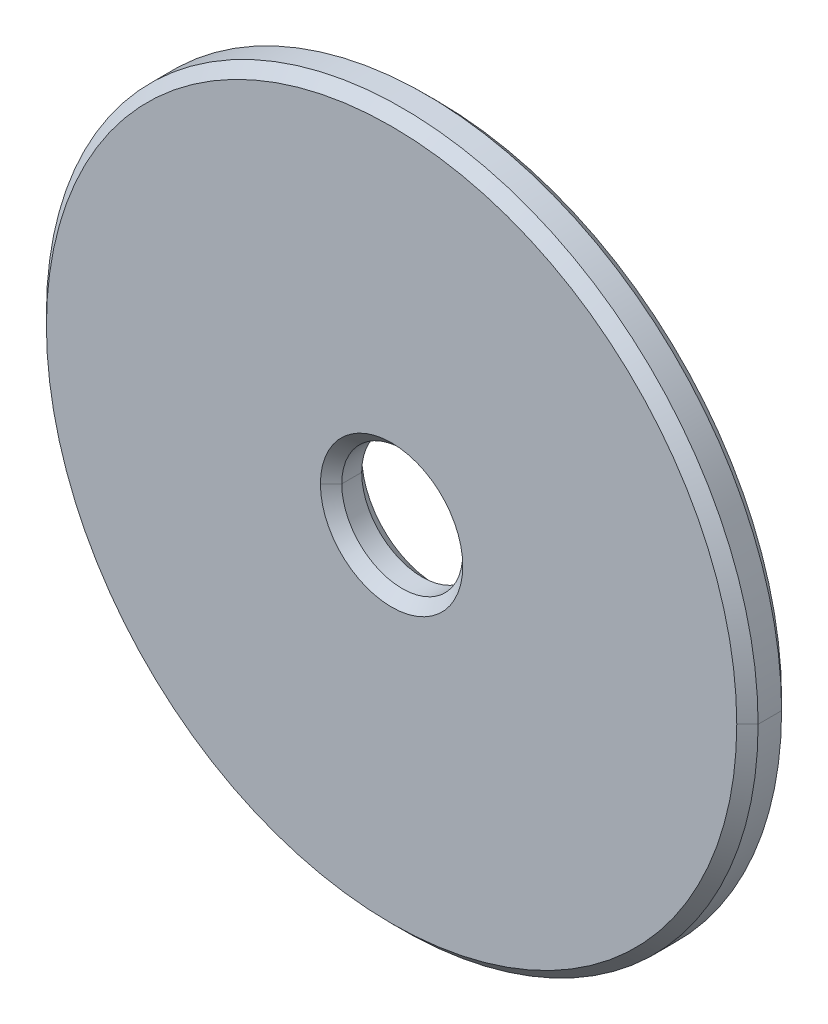
ISO-10303-21;
HEADER;
FILE_DESCRIPTION(('STEP AP214'),'2;1');
FILE_NAME('part.step','',(''),(''),'','','');
FILE_SCHEMA(('AUTOMOTIVE_DESIGN { 1 0 10303 214 1 1 1 1 }'));
ENDSEC;
DATA;
#1=APPLICATION_CONTEXT('core data for automotive mechanical design processes');
#2=APPLICATION_PROTOCOL_DEFINITION('international standard','automotive_design',2000,#1);
#3=PRODUCT_CONTEXT('',#1,'mechanical');
#4=PRODUCT('Part','Part','',(#3));
#5=PRODUCT_RELATED_PRODUCT_CATEGORY('part','',(#4));
#6=PRODUCT_DEFINITION_FORMATION('','',#4);
#7=PRODUCT_DEFINITION_CONTEXT('part definition',#1,'design');
#8=PRODUCT_DEFINITION('design','',#6,#7);
#9=PRODUCT_DEFINITION_SHAPE('','',#8);
#10=(LENGTH_UNIT() NAMED_UNIT(*) SI_UNIT(.MILLI.,.METRE.));
#11=(NAMED_UNIT(*) PLANE_ANGLE_UNIT() SI_UNIT($,.RADIAN.));
#12=(NAMED_UNIT(*) SI_UNIT($,.STERADIAN.) SOLID_ANGLE_UNIT());
#13=UNCERTAINTY_MEASURE_WITH_UNIT(LENGTH_MEASURE(1.E-05),#10,'distance_accuracy_value','');
#14=(GEOMETRIC_REPRESENTATION_CONTEXT(3) GLOBAL_UNCERTAINTY_ASSIGNED_CONTEXT((#13)) GLOBAL_UNIT_ASSIGNED_CONTEXT((#10,
#11,#12)) REPRESENTATION_CONTEXT('',''));
#15=CARTESIAN_POINT('',(0.,0.,0.));
#16=DIRECTION('',(0.,0.,1.));
#17=DIRECTION('',(1.,0.,0.));
#18=AXIS2_PLACEMENT_3D('',#15,#16,#17);
#19=CARTESIAN_POINT('',(0.,0.,3.175));
#20=DIRECTION('',(0.,0.,1.));
#21=DIRECTION('',(1.,0.,0.));
#22=AXIS2_PLACEMENT_3D('',#19,#20,#21);
#23=CYLINDRICAL_SURFACE('',#22,2.159);
#24=CARTESIAN_POINT('',(0.,0.,0.508000000000002));
#25=DIRECTION('',(0.,0.,1.));
#26=DIRECTION('',(1.,0.,0.));
#27=AXIS2_PLACEMENT_3D('',#24,#25,#26);
#28=CIRCLE('',#27,2.159);
#29=CARTESIAN_POINT('',(2.159,0.,0.508000000000001));
#30=VERTEX_POINT('',#29);
#31=CARTESIAN_POINT('',(-2.159,0.,0.508000000000001));
#32=VERTEX_POINT('',#31);
#33=EDGE_CURVE('E83',#30,#32,#28,.T.);
#34=ORIENTED_EDGE('',*,*,#33,.F.);
#35=DIRECTION('',(0.,0.,-1.));
#36=VECTOR('',#35,1.);
#37=CARTESIAN_POINT('',(2.159,0.,1.2192));
#38=LINE('',#37,#36);
#39=CARTESIAN_POINT('',(2.159,0.,1.2192));
#40=VERTEX_POINT('',#39);
#41=EDGE_CURVE('E80',#40,#30,#38,.T.);
#42=ORIENTED_EDGE('',*,*,#41,.F.);
#43=CARTESIAN_POINT('',(0.,0.,1.2192));
#44=DIRECTION('',(0.,0.,-1.));
#45=DIRECTION('',(-1.,0.,0.));
#46=AXIS2_PLACEMENT_3D('',#43,#44,#45);
#47=CIRCLE('',#46,2.159);
#48=CARTESIAN_POINT('',(-2.159,0.,1.2192));
#49=VERTEX_POINT('',#48);
#50=EDGE_CURVE('E11',#49,#40,#47,.T.);
#51=ORIENTED_EDGE('',*,*,#50,.F.);
#52=DIRECTION('',(0.,0.,-1.));
#53=VECTOR('',#52,1.);
#54=CARTESIAN_POINT('',(-2.159,0.,1.2192));
#55=LINE('',#54,#53);
#56=EDGE_CURVE('E20',#49,#32,#55,.T.);
#57=ORIENTED_EDGE('',*,*,#56,.T.);
#58=EDGE_LOOP('',(#34,#42,#51,#57));
#59=FACE_BOUND('',#58,.T.);
#60=ADVANCED_FACE('F17',(#59),#23,.F.);
#61=CARTESIAN_POINT('',(0.,0.,1.18868977120983));
#62=DIRECTION('',(0.,0.,1.));
#63=DIRECTION('',(1.,0.,0.));
#64=AXIS2_PLACEMENT_3D('',#61,#62,#63);
#65=CONICAL_SURFACE('',#64,2.12848977120982,0.785398163397453);
#66=ORIENTED_EDGE('',*,*,#50,.T.);
#67=DIRECTION('',(-0.707106781186551,0.,-0.707106781186544));
#68=VECTOR('',#67,1.);
#69=CARTESIAN_POINT('',(2.54,0.,1.6002));
#70=LINE('',#69,#68);
#71=CARTESIAN_POINT('',(2.54,0.,1.6002));
#72=VERTEX_POINT('',#71);
#73=EDGE_CURVE('E95',#72,#40,#70,.T.);
#74=ORIENTED_EDGE('',*,*,#73,.F.);
#75=CARTESIAN_POINT('',(0.,0.,1.6002));
#76=DIRECTION('',(0.,0.,-1.));
#77=DIRECTION('',(-1.,0.,0.));
#78=AXIS2_PLACEMENT_3D('',#75,#76,#77);
#79=CIRCLE('',#78,2.54);
#80=CARTESIAN_POINT('',(-2.54,0.,1.6002));
#81=VERTEX_POINT('',#80);
#82=EDGE_CURVE('E129',#81,#72,#79,.T.);
#83=ORIENTED_EDGE('',*,*,#82,.F.);
#84=DIRECTION('',(0.707106781186551,0.,-0.707106781186544));
#85=VECTOR('',#84,1.);
#86=CARTESIAN_POINT('',(-2.54,0.,1.6002));
#87=LINE('',#86,#85);
#88=EDGE_CURVE('E26',#81,#49,#87,.T.);
#89=ORIENTED_EDGE('',*,*,#88,.T.);
#90=EDGE_LOOP('',(#66,#74,#83,#89));
#91=FACE_BOUND('',#90,.T.);
#92=ADVANCED_FACE('F94',(#91),#65,.F.);
#93=CARTESIAN_POINT('',(0.,0.,1.18868977120983));
#94=DIRECTION('',(0.,0.,1.));
#95=DIRECTION('',(1.,0.,0.));
#96=AXIS2_PLACEMENT_3D('',#93,#94,#95);
#97=CONICAL_SURFACE('',#96,2.12848977120982,0.785398163397453);
#98=ORIENTED_EDGE('',*,*,#88,.F.);
#99=CARTESIAN_POINT('',(0.,0.,1.6002));
#100=DIRECTION('',(0.,0.,-1.));
#101=DIRECTION('',(1.,0.,0.));
#102=AXIS2_PLACEMENT_3D('',#99,#100,#101);
#103=CIRCLE('',#102,2.54);
#104=EDGE_CURVE('E103',#72,#81,#103,.T.);
#105=ORIENTED_EDGE('',*,*,#104,.F.);
#106=ORIENTED_EDGE('',*,*,#73,.T.);
#107=CARTESIAN_POINT('',(0.,0.,1.2192));
#108=DIRECTION('',(0.,0.,-1.));
#109=DIRECTION('',(1.,0.,0.));
#110=AXIS2_PLACEMENT_3D('',#107,#108,#109);
#111=CIRCLE('',#110,2.159);
#112=EDGE_CURVE('E89',#40,#49,#111,.T.);
#113=ORIENTED_EDGE('',*,*,#112,.T.);
#114=EDGE_LOOP('',(#98,#105,#106,#113));
#115=FACE_BOUND('',#114,.T.);
#116=ADVANCED_FACE('F100',(#115),#97,.F.);
#117=CARTESIAN_POINT('',(0.,0.,3.175));
#118=DIRECTION('',(0.,0.,-1.));
#119=DIRECTION('',(-1.,0.,0.));
#120=AXIS2_PLACEMENT_3D('',#117,#118,#119);
#121=CYLINDRICAL_SURFACE('',#120,12.7);
#122=CARTESIAN_POINT('',(0.,0.,1.21920000000001));
#123=DIRECTION('',(0.,0.,1.));
#124=DIRECTION('',(-1.,0.,0.));
#125=AXIS2_PLACEMENT_3D('',#122,#123,#124);
#126=CIRCLE('',#125,12.7);
#127=CARTESIAN_POINT('',(-12.7,0.,1.2192));
#128=VERTEX_POINT('',#127);
#129=CARTESIAN_POINT('',(12.7,0.,1.2192));
#130=VERTEX_POINT('',#129);
#131=EDGE_CURVE('E106',#128,#130,#126,.T.);
#132=ORIENTED_EDGE('',*,*,#131,.F.);
#133=DIRECTION('',(0.,0.,1.));
#134=VECTOR('',#133,1.);
#135=CARTESIAN_POINT('',(-12.7,0.,0.380999999999999));
#136=LINE('',#135,#134);
#137=CARTESIAN_POINT('',(-12.7,0.,0.381));
#138=VERTEX_POINT('',#137);
#139=EDGE_CURVE('E157',#138,#128,#136,.T.);
#140=ORIENTED_EDGE('',*,*,#139,.F.);
#141=CARTESIAN_POINT('',(0.,0.,0.380999999999996));
#142=DIRECTION('',(0.,0.,-1.));
#143=DIRECTION('',(1.,0.,0.));
#144=AXIS2_PLACEMENT_3D('',#141,#142,#143);
#145=CIRCLE('',#144,12.7);
#146=CARTESIAN_POINT('',(12.7,0.,0.381));
#147=VERTEX_POINT('',#146);
#148=EDGE_CURVE('E175',#147,#138,#145,.T.);
#149=ORIENTED_EDGE('',*,*,#148,.F.);
#150=DIRECTION('',(0.,0.,1.));
#151=VECTOR('',#150,1.);
#152=CARTESIAN_POINT('',(12.7,0.,0.380999999999999));
#153=LINE('',#152,#151);
#154=EDGE_CURVE('E116',#147,#130,#153,.T.);
#155=ORIENTED_EDGE('',*,*,#154,.T.);
#156=EDGE_LOOP('',(#132,#140,#149,#155));
#157=FACE_BOUND('',#156,.T.);
#158=ADVANCED_FACE('F239',(#157),#121,.T.);
#159=CARTESIAN_POINT('',(0.,0.,1.63071022879016));
#160=DIRECTION('',(0.,0.,-1.));
#161=DIRECTION('',(-1.,0.,0.));
#162=AXIS2_PLACEMENT_3D('',#159,#160,#161);
#163=CONICAL_SURFACE('',#162,12.2884897712098,0.785398163397443);
#164=CARTESIAN_POINT('',(0.,0.,1.60019999999998));
#165=DIRECTION('',(0.,0.,1.));
#166=DIRECTION('',(-1.,0.,0.));
#167=AXIS2_PLACEMENT_3D('',#164,#165,#166);
#168=CIRCLE('',#167,12.319);
#169=CARTESIAN_POINT('',(-12.319,0.,1.60019999999999));
#170=VERTEX_POINT('',#169);
#171=CARTESIAN_POINT('',(12.319,0.,1.60019999999999));
#172=VERTEX_POINT('',#171);
#173=EDGE_CURVE('E135',#170,#172,#168,.T.);
#174=ORIENTED_EDGE('',*,*,#173,.F.);
#175=DIRECTION('',(0.707106781186544,0.,0.707106781186551));
#176=VECTOR('',#175,1.);
#177=CARTESIAN_POINT('',(-12.7,0.,1.21920000000001));
#178=LINE('',#177,#176);
#179=EDGE_CURVE('E144',#128,#170,#178,.T.);
#180=ORIENTED_EDGE('',*,*,#179,.F.);
#181=ORIENTED_EDGE('',*,*,#131,.T.);
#182=DIRECTION('',(-0.707106781186544,0.,0.707106781186551));
#183=VECTOR('',#182,1.);
#184=CARTESIAN_POINT('',(12.7,0.,1.21920000000001));
#185=LINE('',#184,#183);
#186=EDGE_CURVE('E140',#130,#172,#185,.T.);
#187=ORIENTED_EDGE('',*,*,#186,.T.);
#188=EDGE_LOOP('',(#174,#180,#181,#187));
#189=FACE_BOUND('',#188,.T.);
#190=ADVANCED_FACE('F244',(#189),#163,.T.);
#191=CARTESIAN_POINT('',(0.,0.,1.6002));
#192=DIRECTION('',(0.,0.,1.));
#193=DIRECTION('',(1.,0.,0.));
#194=AXIS2_PLACEMENT_3D('',#191,#192,#193);
#195=PLANE('',#194);
#196=ORIENTED_EDGE('',*,*,#82,.T.);
#197=ORIENTED_EDGE('',*,*,#104,.T.);
#198=EDGE_LOOP('',(#196,#197));
#199=FACE_BOUND('',#198,.T.);
#200=CARTESIAN_POINT('',(0.,0.,1.60019999999998));
#201=DIRECTION('',(0.,0.,1.));
#202=DIRECTION('',(1.,0.,0.));
#203=AXIS2_PLACEMENT_3D('',#200,#201,#202);
#204=CIRCLE('',#203,12.319);
#205=EDGE_CURVE('E149',#172,#170,#204,.T.);
#206=ORIENTED_EDGE('',*,*,#205,.T.);
#207=ORIENTED_EDGE('',*,*,#173,.T.);
#208=EDGE_LOOP('',(#206,#207));
#209=FACE_BOUND('',#208,.T.);
#210=ADVANCED_FACE('F248',(#199,#209),#195,.T.);
#211=CARTESIAN_POINT('',(0.,0.,1.63071022879016));
#212=DIRECTION('',(0.,0.,-1.));
#213=DIRECTION('',(-1.,0.,0.));
#214=AXIS2_PLACEMENT_3D('',#211,#212,#213);
#215=CONICAL_SURFACE('',#214,12.2884897712098,0.785398163397443);
#216=ORIENTED_EDGE('',*,*,#186,.F.);
#217=CARTESIAN_POINT('',(0.,0.,1.21920000000001));
#218=DIRECTION('',(0.,0.,1.));
#219=DIRECTION('',(1.,0.,0.));
#220=AXIS2_PLACEMENT_3D('',#217,#218,#219);
#221=CIRCLE('',#220,12.7);
#222=EDGE_CURVE('E161',#130,#128,#221,.T.);
#223=ORIENTED_EDGE('',*,*,#222,.T.);
#224=ORIENTED_EDGE('',*,*,#179,.T.);
#225=ORIENTED_EDGE('',*,*,#205,.F.);
#226=EDGE_LOOP('',(#216,#223,#224,#225));
#227=FACE_BOUND('',#226,.T.);
#228=ADVANCED_FACE('F252',(#227),#215,.T.);
#229=CARTESIAN_POINT('',(0.,0.,3.175));
#230=DIRECTION('',(0.,0.,-1.));
#231=DIRECTION('',(-1.,0.,0.));
#232=AXIS2_PLACEMENT_3D('',#229,#230,#231);
#233=CYLINDRICAL_SURFACE('',#232,12.7);
#234=ORIENTED_EDGE('',*,*,#154,.F.);
#235=CARTESIAN_POINT('',(0.,0.,0.380999999999996));
#236=DIRECTION('',(0.,0.,-1.));
#237=DIRECTION('',(-1.,0.,0.));
#238=AXIS2_PLACEMENT_3D('',#235,#236,#237);
#239=CIRCLE('',#238,12.7);
#240=EDGE_CURVE('E166',#138,#147,#239,.T.);
#241=ORIENTED_EDGE('',*,*,#240,.F.);
#242=ORIENTED_EDGE('',*,*,#139,.T.);
#243=ORIENTED_EDGE('',*,*,#222,.F.);
#244=EDGE_LOOP('',(#234,#241,#242,#243));
#245=FACE_BOUND('',#244,.T.);
#246=ADVANCED_FACE('F256',(#245),#233,.T.);
#247=CARTESIAN_POINT('',(0.,0.,-0.0305102287901839));
#248=DIRECTION('',(0.,0.,1.));
#249=DIRECTION('',(1.,0.,0.));
#250=AXIS2_PLACEMENT_3D('',#247,#248,#249);
#251=CONICAL_SURFACE('',#250,12.2884897712098,0.785398163397448);
#252=DIRECTION('',(0.707106781186547,0.,-0.707106781186547));
#253=VECTOR('',#252,1.);
#254=CARTESIAN_POINT('',(-12.7,0.,0.381000000000001));
#255=LINE('',#254,#253);
#256=CARTESIAN_POINT('',(-12.319,0.,0.));
#257=VERTEX_POINT('',#256);
#258=EDGE_CURVE('E180',#138,#257,#255,.T.);
#259=ORIENTED_EDGE('',*,*,#258,.F.);
#260=ORIENTED_EDGE('',*,*,#240,.T.);
#261=DIRECTION('',(-0.707106781186547,0.,-0.707106781186547));
#262=VECTOR('',#261,1.);
#263=CARTESIAN_POINT('',(12.7,0.,0.381000000000001));
#264=LINE('',#263,#262);
#265=CARTESIAN_POINT('',(12.319,0.,0.));
#266=VERTEX_POINT('',#265);
#267=EDGE_CURVE('E171',#147,#266,#264,.T.);
#268=ORIENTED_EDGE('',*,*,#267,.T.);
#269=CARTESIAN_POINT('',(0.,0.,0.));
#270=DIRECTION('',(0.,0.,-1.));
#271=DIRECTION('',(-1.,0.,0.));
#272=AXIS2_PLACEMENT_3D('',#269,#270,#271);
#273=CIRCLE('',#272,12.319);
#274=EDGE_CURVE('E185',#257,#266,#273,.T.);
#275=ORIENTED_EDGE('',*,*,#274,.F.);
#276=EDGE_LOOP('',(#259,#260,#268,#275));
#277=FACE_BOUND('',#276,.T.);
#278=ADVANCED_FACE('F260',(#277),#251,.T.);
#279=CARTESIAN_POINT('',(0.,0.,-0.0305102287901839));
#280=DIRECTION('',(0.,0.,1.));
#281=DIRECTION('',(1.,0.,0.));
#282=AXIS2_PLACEMENT_3D('',#279,#280,#281);
#283=CONICAL_SURFACE('',#282,12.2884897712098,0.785398163397448);
#284=CARTESIAN_POINT('',(0.,0.,0.));
#285=DIRECTION('',(0.,0.,-1.));
#286=DIRECTION('',(1.,0.,0.));
#287=AXIS2_PLACEMENT_3D('',#284,#285,#286);
#288=CIRCLE('',#287,12.319);
#289=EDGE_CURVE('E190',#266,#257,#288,.T.);
#290=ORIENTED_EDGE('',*,*,#289,.F.);
#291=ORIENTED_EDGE('',*,*,#267,.F.);
#292=ORIENTED_EDGE('',*,*,#148,.T.);
#293=ORIENTED_EDGE('',*,*,#258,.T.);
#294=EDGE_LOOP('',(#290,#291,#292,#293));
#295=FACE_BOUND('',#294,.T.);
#296=ADVANCED_FACE('F230',(#295),#283,.T.);
#297=CARTESIAN_POINT('',(0.,0.,0.));
#298=DIRECTION('',(0.,0.,1.));
#299=DIRECTION('',(1.,0.,0.));
#300=AXIS2_PLACEMENT_3D('',#297,#298,#299);
#301=PLANE('',#300);
#302=CARTESIAN_POINT('',(0.,0.,0.));
#303=DIRECTION('',(0.,0.,1.));
#304=DIRECTION('',(1.,0.,0.));
#305=AXIS2_PLACEMENT_3D('',#302,#303,#304);
#306=CIRCLE('',#305,2.667);
#307=CARTESIAN_POINT('',(2.667,0.,0.));
#308=VERTEX_POINT('',#307);
#309=CARTESIAN_POINT('',(-2.667,0.,0.));
#310=VERTEX_POINT('',#309);
#311=EDGE_CURVE('E32',#308,#310,#306,.T.);
#312=ORIENTED_EDGE('',*,*,#311,.T.);
#313=CARTESIAN_POINT('',(0.,0.,0.));
#314=DIRECTION('',(0.,0.,1.));
#315=DIRECTION('',(-1.,0.,0.));
#316=AXIS2_PLACEMENT_3D('',#313,#314,#315);
#317=CIRCLE('',#316,2.667);
#318=EDGE_CURVE('E36',#310,#308,#317,.T.);
#319=ORIENTED_EDGE('',*,*,#318,.T.);
#320=EDGE_LOOP('',(#312,#319));
#321=FACE_BOUND('',#320,.T.);
#322=ORIENTED_EDGE('',*,*,#274,.T.);
#323=ORIENTED_EDGE('',*,*,#289,.T.);
#324=EDGE_LOOP('',(#322,#323));
#325=FACE_BOUND('',#324,.T.);
#326=ADVANCED_FACE('F223',(#321,#325),#301,.F.);
#327=CARTESIAN_POINT('',(0.,0.,0.538510228790176));
#328=DIRECTION('',(0.,0.,-1.));
#329=DIRECTION('',(-1.,0.,0.));
#330=AXIS2_PLACEMENT_3D('',#327,#328,#329);
#331=CONICAL_SURFACE('',#330,2.12848977120982,0.785398163397448);
#332=ORIENTED_EDGE('',*,*,#33,.T.);
#333=DIRECTION('',(0.707106781186547,0.,0.707106781186548));
#334=VECTOR('',#333,1.);
#335=CARTESIAN_POINT('',(-2.667,0.,0.));
#336=LINE('',#335,#334);
#337=EDGE_CURVE('E114',#310,#32,#336,.T.);
#338=ORIENTED_EDGE('',*,*,#337,.F.);
#339=ORIENTED_EDGE('',*,*,#311,.F.);
#340=DIRECTION('',(-0.707106781186547,0.,0.707106781186548));
#341=VECTOR('',#340,1.);
#342=CARTESIAN_POINT('',(2.667,0.,0.));
#343=LINE('',#342,#341);
#344=EDGE_CURVE('E201',#308,#30,#343,.T.);
#345=ORIENTED_EDGE('',*,*,#344,.T.);
#346=EDGE_LOOP('',(#332,#338,#339,#345));
#347=FACE_BOUND('',#346,.T.);
#348=ADVANCED_FACE('F221',(#347),#331,.F.);
#349=CARTESIAN_POINT('',(0.,0.,0.538510228790176));
#350=DIRECTION('',(0.,0.,-1.));
#351=DIRECTION('',(-1.,0.,0.));
#352=AXIS2_PLACEMENT_3D('',#349,#350,#351);
#353=CONICAL_SURFACE('',#352,2.12848977120982,0.785398163397448);
#354=ORIENTED_EDGE('',*,*,#344,.F.);
#355=ORIENTED_EDGE('',*,*,#318,.F.);
#356=ORIENTED_EDGE('',*,*,#337,.T.);
#357=CARTESIAN_POINT('',(0.,0.,0.508000000000002));
#358=DIRECTION('',(0.,0.,1.));
#359=DIRECTION('',(-1.,0.,0.));
#360=AXIS2_PLACEMENT_3D('',#357,#358,#359);
#361=CIRCLE('',#360,2.159);
#362=EDGE_CURVE('E90',#32,#30,#361,.T.);
#363=ORIENTED_EDGE('',*,*,#362,.T.);
#364=EDGE_LOOP('',(#354,#355,#356,#363));
#365=FACE_BOUND('',#364,.T.);
#366=ADVANCED_FACE('F219',(#365),#353,.F.);
#367=CARTESIAN_POINT('',(0.,0.,3.175));
#368=DIRECTION('',(0.,0.,1.));
#369=DIRECTION('',(1.,0.,0.));
#370=AXIS2_PLACEMENT_3D('',#367,#368,#369);
#371=CYLINDRICAL_SURFACE('',#370,2.159);
#372=ORIENTED_EDGE('',*,*,#56,.F.);
#373=ORIENTED_EDGE('',*,*,#112,.F.);
#374=ORIENTED_EDGE('',*,*,#41,.T.);
#375=ORIENTED_EDGE('',*,*,#362,.F.);
#376=EDGE_LOOP('',(#372,#373,#374,#375));
#377=FACE_BOUND('',#376,.T.);
#378=ADVANCED_FACE('F108',(#377),#371,.F.);
#379=CLOSED_SHELL('',(#60,#92,#116,#158,#190,#210,#228,#246,#278,#296,#326,#348,#366,#378));
#380=MANIFOLD_SOLID_BREP('B1',#379);
#381=ADVANCED_BREP_SHAPE_REPRESENTATION('',(#18,#380),#14);
#382=SHAPE_DEFINITION_REPRESENTATION(#9,#381);
ENDSEC;
END-ISO-10303-21;
